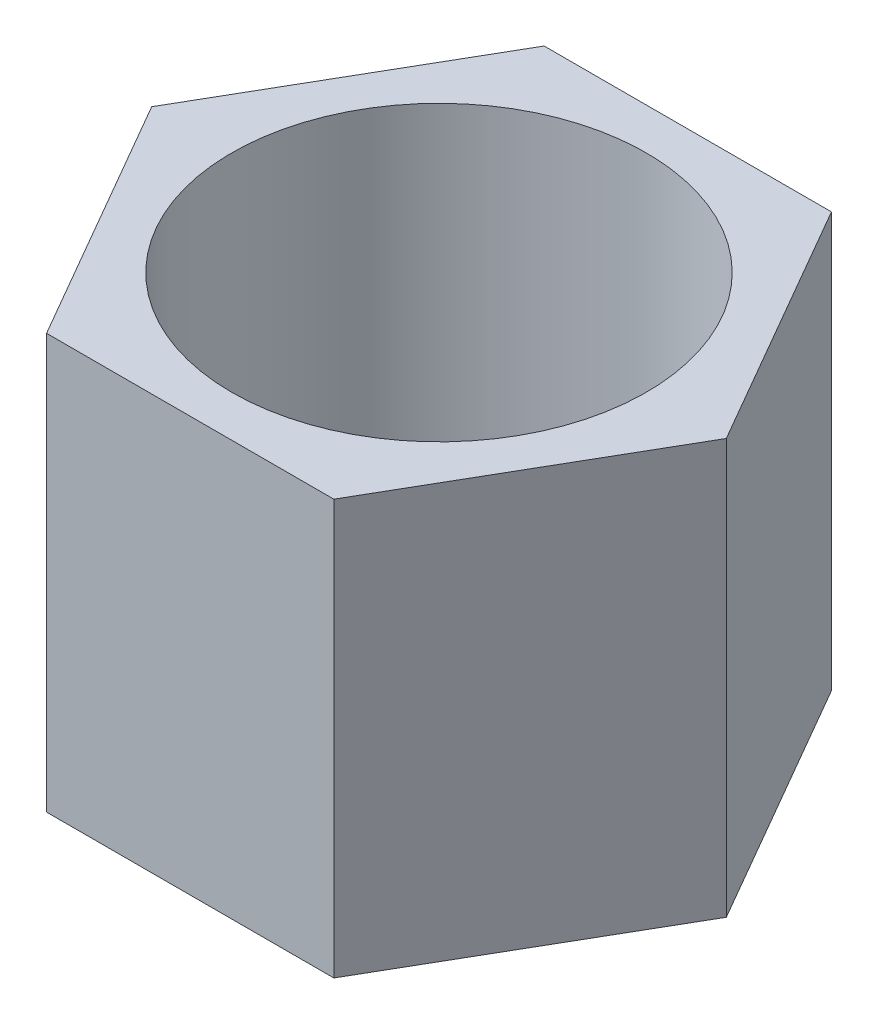
ISO-10303-21;
HEADER;
FILE_DESCRIPTION(('STEP AP214'),'2;1');
FILE_NAME('part.step','',(''),(''),'','','');
FILE_SCHEMA(('AUTOMOTIVE_DESIGN { 1 0 10303 214 1 1 1 1 }'));
ENDSEC;
DATA;
#1=APPLICATION_CONTEXT('core data for automotive mechanical design processes');
#2=APPLICATION_PROTOCOL_DEFINITION('international standard','automotive_design',2000,#1);
#3=PRODUCT_CONTEXT('',#1,'mechanical');
#4=PRODUCT('Part','Part','',(#3));
#5=PRODUCT_RELATED_PRODUCT_CATEGORY('part','',(#4));
#6=PRODUCT_DEFINITION_FORMATION('','',#4);
#7=PRODUCT_DEFINITION_CONTEXT('part definition',#1,'design');
#8=PRODUCT_DEFINITION('design','',#6,#7);
#9=PRODUCT_DEFINITION_SHAPE('','',#8);
#10=(LENGTH_UNIT() NAMED_UNIT(*) SI_UNIT(.MILLI.,.METRE.));
#11=(NAMED_UNIT(*) PLANE_ANGLE_UNIT() SI_UNIT($,.RADIAN.));
#12=(NAMED_UNIT(*) SI_UNIT($,.STERADIAN.) SOLID_ANGLE_UNIT());
#13=UNCERTAINTY_MEASURE_WITH_UNIT(LENGTH_MEASURE(1.E-05),#10,'distance_accuracy_value','');
#14=(GEOMETRIC_REPRESENTATION_CONTEXT(3) GLOBAL_UNCERTAINTY_ASSIGNED_CONTEXT((#13)) GLOBAL_UNIT_ASSIGNED_CONTEXT((#10,
#11,#12)) REPRESENTATION_CONTEXT('',''));
#15=CARTESIAN_POINT('',(0.,0.,0.));
#16=DIRECTION('',(0.,0.,1.));
#17=DIRECTION('',(1.,0.,0.));
#18=AXIS2_PLACEMENT_3D('',#15,#16,#17);
#19=CARTESIAN_POINT('',(0.,10.,0.));
#20=DIRECTION('',(0.,1.,0.));
#21=DIRECTION('',(0.,0.,1.));
#22=AXIS2_PLACEMENT_3D('',#19,#20,#21);
#23=PLANE('',#22);
#24=DIRECTION('',(0.5,0.,-0.866025403784439));
#25=VECTOR('',#24,1.);
#26=CARTESIAN_POINT('',(3.46410161513775,10.,6.));
#27=LINE('',#26,#25);
#28=CARTESIAN_POINT('',(3.46410161513775,10.,6.));
#29=VERTEX_POINT('',#28);
#30=CARTESIAN_POINT('',(6.92820323027551,10.,0.));
#31=VERTEX_POINT('',#30);
#32=EDGE_CURVE('E140',#29,#31,#27,.T.);
#33=ORIENTED_EDGE('',*,*,#32,.T.);
#34=DIRECTION('',(-0.5,0.,-0.866025403784438));
#35=VECTOR('',#34,1.);
#36=CARTESIAN_POINT('',(6.92820323027551,10.,0.));
#37=LINE('',#36,#35);
#38=CARTESIAN_POINT('',(3.46410161513775,10.,-6.));
#39=VERTEX_POINT('',#38);
#40=EDGE_CURVE('E94',#31,#39,#37,.T.);
#41=ORIENTED_EDGE('',*,*,#40,.T.);
#42=DIRECTION('',(-1.,0.,0.));
#43=VECTOR('',#42,1.);
#44=CARTESIAN_POINT('',(3.46410161513775,10.,-6.));
#45=LINE('',#44,#43);
#46=CARTESIAN_POINT('',(-3.46410161513776,10.,-6.));
#47=VERTEX_POINT('',#46);
#48=EDGE_CURVE('E109',#39,#47,#45,.T.);
#49=ORIENTED_EDGE('',*,*,#48,.T.);
#50=DIRECTION('',(-0.5,0.,0.866025403784439));
#51=VECTOR('',#50,1.);
#52=CARTESIAN_POINT('',(-3.46410161513776,10.,-6.));
#53=LINE('',#52,#51);
#54=CARTESIAN_POINT('',(-6.92820323027551,10.,0.));
#55=VERTEX_POINT('',#54);
#56=EDGE_CURVE('E105',#47,#55,#53,.T.);
#57=ORIENTED_EDGE('',*,*,#56,.T.);
#58=DIRECTION('',(0.5,0.,0.866025403784439));
#59=VECTOR('',#58,1.);
#60=CARTESIAN_POINT('',(-6.92820323027551,10.,0.));
#61=LINE('',#60,#59);
#62=CARTESIAN_POINT('',(-3.46410161513775,10.,6.));
#63=VERTEX_POINT('',#62);
#64=EDGE_CURVE('E106',#55,#63,#61,.T.);
#65=ORIENTED_EDGE('',*,*,#64,.T.);
#66=DIRECTION('',(1.,0.,0.));
#67=VECTOR('',#66,1.);
#68=CARTESIAN_POINT('',(-3.46410161513775,10.,6.));
#69=LINE('',#68,#67);
#70=EDGE_CURVE('E59',#63,#29,#69,.T.);
#71=ORIENTED_EDGE('',*,*,#70,.T.);
#72=EDGE_LOOP('',(#33,#41,#49,#57,#65,#71));
#73=FACE_BOUND('',#72,.T.);
#74=CARTESIAN_POINT('',(0.,10.,0.));
#75=DIRECTION('',(0.,1.,0.));
#76=DIRECTION('',(0.,0.,1.));
#77=AXIS2_PLACEMENT_3D('',#74,#75,#76);
#78=CIRCLE('',#77,5.);
#79=CARTESIAN_POINT('',(0.,10.,5.));
#80=VERTEX_POINT('',#79);
#81=EDGE_CURVE('E127',#80,#80,#78,.T.);
#82=ORIENTED_EDGE('',*,*,#81,.F.);
#83=EDGE_LOOP('',(#82));
#84=FACE_BOUND('',#83,.T.);
#85=ADVANCED_FACE('F41',(#73,#84),#23,.T.);
#86=CARTESIAN_POINT('',(0.,0.,0.));
#87=DIRECTION('',(0.,1.,0.));
#88=DIRECTION('',(0.,0.,1.));
#89=AXIS2_PLACEMENT_3D('',#86,#87,#88);
#90=PLANE('',#89);
#91=DIRECTION('',(0.5,0.,-0.866025403784439));
#92=VECTOR('',#91,1.);
#93=CARTESIAN_POINT('',(3.46410161513775,0.,6.));
#94=LINE('',#93,#92);
#95=CARTESIAN_POINT('',(3.46410161513775,0.,6.));
#96=VERTEX_POINT('',#95);
#97=CARTESIAN_POINT('',(6.92820323027551,0.,0.));
#98=VERTEX_POINT('',#97);
#99=EDGE_CURVE('E128',#96,#98,#94,.T.);
#100=ORIENTED_EDGE('',*,*,#99,.F.);
#101=DIRECTION('',(1.,0.,0.));
#102=VECTOR('',#101,1.);
#103=CARTESIAN_POINT('',(-3.46410161513775,0.,6.));
#104=LINE('',#103,#102);
#105=CARTESIAN_POINT('',(-3.46410161513775,0.,6.));
#106=VERTEX_POINT('',#105);
#107=EDGE_CURVE('E90',#106,#96,#104,.T.);
#108=ORIENTED_EDGE('',*,*,#107,.F.);
#109=DIRECTION('',(0.5,0.,0.866025403784439));
#110=VECTOR('',#109,1.);
#111=CARTESIAN_POINT('',(-6.92820323027551,0.,0.));
#112=LINE('',#111,#110);
#113=CARTESIAN_POINT('',(-6.92820323027551,0.,0.));
#114=VERTEX_POINT('',#113);
#115=EDGE_CURVE('E83',#114,#106,#112,.T.);
#116=ORIENTED_EDGE('',*,*,#115,.F.);
#117=DIRECTION('',(-0.5,0.,0.866025403784439));
#118=VECTOR('',#117,1.);
#119=CARTESIAN_POINT('',(-3.46410161513776,0.,-6.));
#120=LINE('',#119,#118);
#121=CARTESIAN_POINT('',(-3.46410161513776,0.,-6.));
#122=VERTEX_POINT('',#121);
#123=EDGE_CURVE('E116',#122,#114,#120,.T.);
#124=ORIENTED_EDGE('',*,*,#123,.F.);
#125=DIRECTION('',(-1.,0.,0.));
#126=VECTOR('',#125,1.);
#127=CARTESIAN_POINT('',(3.46410161513775,0.,-6.));
#128=LINE('',#127,#126);
#129=CARTESIAN_POINT('',(3.46410161513775,0.,-6.));
#130=VERTEX_POINT('',#129);
#131=EDGE_CURVE('E135',#130,#122,#128,.T.);
#132=ORIENTED_EDGE('',*,*,#131,.F.);
#133=DIRECTION('',(-0.5,0.,-0.866025403784438));
#134=VECTOR('',#133,1.);
#135=CARTESIAN_POINT('',(6.92820323027551,0.,0.));
#136=LINE('',#135,#134);
#137=EDGE_CURVE('E129',#98,#130,#136,.T.);
#138=ORIENTED_EDGE('',*,*,#137,.F.);
#139=EDGE_LOOP('',(#100,#108,#116,#124,#132,#138));
#140=FACE_BOUND('',#139,.T.);
#141=CARTESIAN_POINT('',(0.,0.,0.));
#142=DIRECTION('',(0.,1.,0.));
#143=DIRECTION('',(0.,0.,1.));
#144=AXIS2_PLACEMENT_3D('',#141,#142,#143);
#145=CIRCLE('',#144,5.);
#146=CARTESIAN_POINT('',(0.,0.,5.));
#147=VERTEX_POINT('',#146);
#148=EDGE_CURVE('E229',#147,#147,#145,.T.);
#149=ORIENTED_EDGE('',*,*,#148,.T.);
#150=EDGE_LOOP('',(#149));
#151=FACE_BOUND('',#150,.T.);
#152=ADVANCED_FACE('F147',(#140,#151),#90,.F.);
#153=CARTESIAN_POINT('',(3.46410161513775,10.,6.));
#154=DIRECTION('',(-0.866025403784439,0.,-0.5));
#155=DIRECTION('',(-0.5,0.,0.866025403784439));
#156=AXIS2_PLACEMENT_3D('',#153,#154,#155);
#157=PLANE('',#156);
#158=ORIENTED_EDGE('',*,*,#99,.T.);
#159=DIRECTION('',(0.,-1.,0.));
#160=VECTOR('',#159,1.);
#161=CARTESIAN_POINT('',(6.92820323027551,10.,0.));
#162=LINE('',#161,#160);
#163=EDGE_CURVE('E11',#31,#98,#162,.T.);
#164=ORIENTED_EDGE('',*,*,#163,.F.);
#165=ORIENTED_EDGE('',*,*,#32,.F.);
#166=DIRECTION('',(0.,-1.,0.));
#167=VECTOR('',#166,1.);
#168=CARTESIAN_POINT('',(3.46410161513775,10.,6.));
#169=LINE('',#168,#167);
#170=EDGE_CURVE('E122',#29,#96,#169,.T.);
#171=ORIENTED_EDGE('',*,*,#170,.T.);
#172=EDGE_LOOP('',(#158,#164,#165,#171));
#173=FACE_BOUND('',#172,.T.);
#174=ADVANCED_FACE('F43',(#173),#157,.F.);
#175=CARTESIAN_POINT('',(6.92820323027551,10.,0.));
#176=DIRECTION('',(-0.866025403784439,0.,0.5));
#177=DIRECTION('',(0.5,0.,0.866025403784439));
#178=AXIS2_PLACEMENT_3D('',#175,#176,#177);
#179=PLANE('',#178);
#180=ORIENTED_EDGE('',*,*,#137,.T.);
#181=DIRECTION('',(0.,-1.,0.));
#182=VECTOR('',#181,1.);
#183=CARTESIAN_POINT('',(3.46410161513775,10.,-6.));
#184=LINE('',#183,#182);
#185=EDGE_CURVE('E49',#39,#130,#184,.T.);
#186=ORIENTED_EDGE('',*,*,#185,.F.);
#187=ORIENTED_EDGE('',*,*,#40,.F.);
#188=ORIENTED_EDGE('',*,*,#163,.T.);
#189=EDGE_LOOP('',(#180,#186,#187,#188));
#190=FACE_BOUND('',#189,.T.);
#191=ADVANCED_FACE('F173',(#190),#179,.F.);
#192=CARTESIAN_POINT('',(3.46410161513775,10.,-6.));
#193=DIRECTION('',(0.,0.,1.));
#194=DIRECTION('',(1.,0.,0.));
#195=AXIS2_PLACEMENT_3D('',#192,#193,#194);
#196=PLANE('',#195);
#197=ORIENTED_EDGE('',*,*,#131,.T.);
#198=DIRECTION('',(0.,-1.,0.));
#199=VECTOR('',#198,1.);
#200=CARTESIAN_POINT('',(-3.46410161513776,10.,-6.));
#201=LINE('',#200,#199);
#202=EDGE_CURVE('E117',#47,#122,#201,.T.);
#203=ORIENTED_EDGE('',*,*,#202,.F.);
#204=ORIENTED_EDGE('',*,*,#48,.F.);
#205=ORIENTED_EDGE('',*,*,#185,.T.);
#206=EDGE_LOOP('',(#197,#203,#204,#205));
#207=FACE_BOUND('',#206,.T.);
#208=ADVANCED_FACE('F142',(#207),#196,.F.);
#209=CARTESIAN_POINT('',(-3.46410161513776,10.,-6.));
#210=DIRECTION('',(0.866025403784439,0.,0.5));
#211=DIRECTION('',(0.5,0.,-0.866025403784439));
#212=AXIS2_PLACEMENT_3D('',#209,#210,#211);
#213=PLANE('',#212);
#214=ORIENTED_EDGE('',*,*,#123,.T.);
#215=DIRECTION('',(0.,-1.,0.));
#216=VECTOR('',#215,1.);
#217=CARTESIAN_POINT('',(-6.92820323027551,10.,0.));
#218=LINE('',#217,#216);
#219=EDGE_CURVE('E111',#55,#114,#218,.T.);
#220=ORIENTED_EDGE('',*,*,#219,.F.);
#221=ORIENTED_EDGE('',*,*,#56,.F.);
#222=ORIENTED_EDGE('',*,*,#202,.T.);
#223=EDGE_LOOP('',(#214,#220,#221,#222));
#224=FACE_BOUND('',#223,.T.);
#225=ADVANCED_FACE('F114',(#224),#213,.F.);
#226=CARTESIAN_POINT('',(-6.92820323027551,10.,0.));
#227=DIRECTION('',(0.866025403784439,0.,-0.5));
#228=DIRECTION('',(-0.5,0.,-0.866025403784439));
#229=AXIS2_PLACEMENT_3D('',#226,#227,#228);
#230=PLANE('',#229);
#231=ORIENTED_EDGE('',*,*,#115,.T.);
#232=DIRECTION('',(0.,-1.,0.));
#233=VECTOR('',#232,1.);
#234=CARTESIAN_POINT('',(-3.46410161513775,10.,6.));
#235=LINE('',#234,#233);
#236=EDGE_CURVE('E119',#63,#106,#235,.T.);
#237=ORIENTED_EDGE('',*,*,#236,.F.);
#238=ORIENTED_EDGE('',*,*,#64,.F.);
#239=ORIENTED_EDGE('',*,*,#219,.T.);
#240=EDGE_LOOP('',(#231,#237,#238,#239));
#241=FACE_BOUND('',#240,.T.);
#242=ADVANCED_FACE('F120',(#241),#230,.F.);
#243=CARTESIAN_POINT('',(-3.46410161513775,10.,6.));
#244=DIRECTION('',(0.,0.,-1.));
#245=DIRECTION('',(-1.,0.,0.));
#246=AXIS2_PLACEMENT_3D('',#243,#244,#245);
#247=PLANE('',#246);
#248=ORIENTED_EDGE('',*,*,#107,.T.);
#249=ORIENTED_EDGE('',*,*,#170,.F.);
#250=ORIENTED_EDGE('',*,*,#70,.F.);
#251=ORIENTED_EDGE('',*,*,#236,.T.);
#252=EDGE_LOOP('',(#248,#249,#250,#251));
#253=FACE_BOUND('',#252,.T.);
#254=ADVANCED_FACE('F151',(#253),#247,.F.);
#255=CARTESIAN_POINT('',(0.,10.,0.));
#256=DIRECTION('',(0.,-1.,0.));
#257=DIRECTION('',(0.,0.,-1.));
#258=AXIS2_PLACEMENT_3D('',#255,#256,#257);
#259=CYLINDRICAL_SURFACE('',#258,5.);
#260=ORIENTED_EDGE('',*,*,#81,.T.);
#261=EDGE_LOOP('',(#260));
#262=FACE_BOUND('',#261,.T.);
#263=ORIENTED_EDGE('',*,*,#148,.F.);
#264=EDGE_LOOP('',(#263));
#265=FACE_BOUND('',#264,.T.);
#266=ADVANCED_FACE('F154',(#262,#265),#259,.F.);
#267=CLOSED_SHELL('',(#85,#152,#174,#191,#208,#225,#242,#254,#266));
#268=MANIFOLD_SOLID_BREP('B2',#267);
#269=ADVANCED_BREP_SHAPE_REPRESENTATION('',(#18,#268),#14);
#270=SHAPE_DEFINITION_REPRESENTATION(#9,#269);
ENDSEC;
END-ISO-10303-21;
